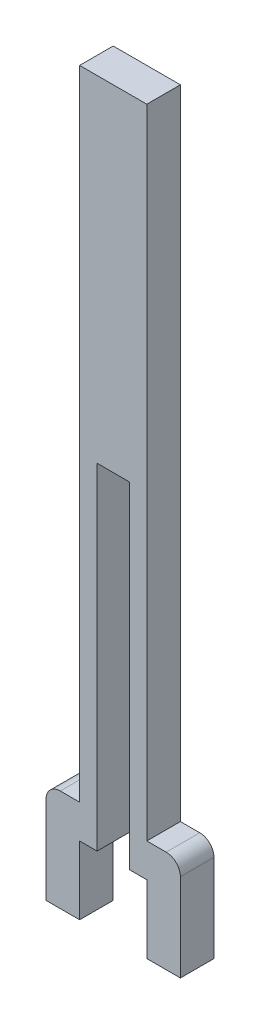
ISO-10303-21;
HEADER;
FILE_DESCRIPTION(('STEP AP214'),'2;1');
FILE_NAME('part.step','',(''),(''),'','','');
FILE_SCHEMA(('AUTOMOTIVE_DESIGN { 1 0 10303 214 1 1 1 1 }'));
ENDSEC;
DATA;
#1=APPLICATION_CONTEXT('core data for automotive mechanical design processes');
#2=APPLICATION_PROTOCOL_DEFINITION('international standard','automotive_design',2000,#1);
#3=PRODUCT_CONTEXT('',#1,'mechanical');
#4=PRODUCT('Part','Part','',(#3));
#5=PRODUCT_RELATED_PRODUCT_CATEGORY('part','',(#4));
#6=PRODUCT_DEFINITION_FORMATION('','',#4);
#7=PRODUCT_DEFINITION_CONTEXT('part definition',#1,'design');
#8=PRODUCT_DEFINITION('design','',#6,#7);
#9=PRODUCT_DEFINITION_SHAPE('','',#8);
#10=(LENGTH_UNIT() NAMED_UNIT(*) SI_UNIT(.MILLI.,.METRE.));
#11=(NAMED_UNIT(*) PLANE_ANGLE_UNIT() SI_UNIT($,.RADIAN.));
#12=(NAMED_UNIT(*) SI_UNIT($,.STERADIAN.) SOLID_ANGLE_UNIT());
#13=UNCERTAINTY_MEASURE_WITH_UNIT(LENGTH_MEASURE(1.E-05),#10,'distance_accuracy_value','');
#14=(GEOMETRIC_REPRESENTATION_CONTEXT(3) GLOBAL_UNCERTAINTY_ASSIGNED_CONTEXT((#13)) GLOBAL_UNIT_ASSIGNED_CONTEXT((#10,
#11,#12)) REPRESENTATION_CONTEXT('',''));
#15=CARTESIAN_POINT('',(0.,0.,0.));
#16=DIRECTION('',(0.,0.,1.));
#17=DIRECTION('',(1.,0.,0.));
#18=AXIS2_PLACEMENT_3D('',#15,#16,#17);
#19=CARTESIAN_POINT('',(0.,-26.944,3.));
#20=DIRECTION('',(0.,1.,0.));
#21=DIRECTION('',(0.,0.,1.));
#22=AXIS2_PLACEMENT_3D('',#19,#20,#21);
#23=PLANE('',#22);
#24=DIRECTION('',(1.,0.,0.));
#25=VECTOR('',#24,1.);
#26=CARTESIAN_POINT('',(0.,-26.944,3.));
#27=LINE('',#26,#25);
#28=CARTESIAN_POINT('',(1.43999999999999,-26.944,3.));
#29=VERTEX_POINT('',#28);
#30=CARTESIAN_POINT('',(3.,-26.944,3.));
#31=VERTEX_POINT('',#30);
#32=EDGE_CURVE('E220',#29,#31,#27,.T.);
#33=ORIENTED_EDGE('',*,*,#32,.F.);
#34=DIRECTION('',(0.,0.,-1.));
#35=VECTOR('',#34,1.);
#36=CARTESIAN_POINT('',(1.43999999999999,-26.944,33.1319504181193));
#37=LINE('',#36,#35);
#38=CARTESIAN_POINT('',(1.43999999999999,-26.944,0.));
#39=VERTEX_POINT('',#38);
#40=EDGE_CURVE('E176',#29,#39,#37,.T.);
#41=ORIENTED_EDGE('',*,*,#40,.T.);
#42=DIRECTION('',(1.,0.,0.));
#43=VECTOR('',#42,1.);
#44=CARTESIAN_POINT('',(0.,-26.944,0.));
#45=LINE('',#44,#43);
#46=CARTESIAN_POINT('',(3.,-26.944,0.));
#47=VERTEX_POINT('',#46);
#48=EDGE_CURVE('E251',#39,#47,#45,.T.);
#49=ORIENTED_EDGE('',*,*,#48,.T.);
#50=DIRECTION('',(0.,0.,-1.));
#51=VECTOR('',#50,1.);
#52=CARTESIAN_POINT('',(3.,-26.944,3.));
#53=LINE('',#52,#51);
#54=EDGE_CURVE('E276',#31,#47,#53,.T.);
#55=ORIENTED_EDGE('',*,*,#54,.F.);
#56=EDGE_LOOP('',(#33,#41,#49,#55));
#57=FACE_BOUND('',#56,.T.);
#58=ADVANCED_FACE('F45',(#57),#23,.F.);
#59=CARTESIAN_POINT('',(0.,33.044,3.));
#60=DIRECTION('',(0.,1.,0.));
#61=DIRECTION('',(0.,0.,1.));
#62=AXIS2_PLACEMENT_3D('',#59,#60,#61);
#63=PLANE('',#62);
#64=DIRECTION('',(1.,0.,0.));
#65=VECTOR('',#64,1.);
#66=CARTESIAN_POINT('',(0.,33.044,0.));
#67=LINE('',#66,#65);
#68=CARTESIAN_POINT('',(-3.,33.044,0.));
#69=VERTEX_POINT('',#68);
#70=CARTESIAN_POINT('',(3.,33.044,0.));
#71=VERTEX_POINT('',#70);
#72=EDGE_CURVE('E204',#69,#71,#67,.T.);
#73=ORIENTED_EDGE('',*,*,#72,.F.);
#74=DIRECTION('',(0.,0.,-1.));
#75=VECTOR('',#74,1.);
#76=CARTESIAN_POINT('',(-3.,33.044,3.));
#77=LINE('',#76,#75);
#78=CARTESIAN_POINT('',(-3.,33.044,3.));
#79=VERTEX_POINT('',#78);
#80=EDGE_CURVE('E290',#79,#69,#77,.T.);
#81=ORIENTED_EDGE('',*,*,#80,.F.);
#82=DIRECTION('',(1.,0.,0.));
#83=VECTOR('',#82,1.);
#84=CARTESIAN_POINT('',(0.,33.044,3.));
#85=LINE('',#84,#83);
#86=CARTESIAN_POINT('',(3.,33.044,3.));
#87=VERTEX_POINT('',#86);
#88=EDGE_CURVE('E205',#79,#87,#85,.T.);
#89=ORIENTED_EDGE('',*,*,#88,.T.);
#90=DIRECTION('',(0.,0.,-1.));
#91=VECTOR('',#90,1.);
#92=CARTESIAN_POINT('',(3.,33.044,3.));
#93=LINE('',#92,#91);
#94=EDGE_CURVE('E236',#87,#71,#93,.T.);
#95=ORIENTED_EDGE('',*,*,#94,.T.);
#96=EDGE_LOOP('',(#73,#81,#89,#95));
#97=FACE_BOUND('',#96,.T.);
#98=ADVANCED_FACE('F336',(#97),#63,.T.);
#99=CARTESIAN_POINT('',(-3.,0.,3.));
#100=DIRECTION('',(-1.,0.,0.));
#101=DIRECTION('',(0.,0.,1.));
#102=AXIS2_PLACEMENT_3D('',#99,#100,#101);
#103=PLANE('',#102);
#104=DIRECTION('',(0.,1.,0.));
#105=VECTOR('',#104,1.);
#106=CARTESIAN_POINT('',(-3.,0.,0.));
#107=LINE('',#106,#105);
#108=CARTESIAN_POINT('',(-3.,-23.944,0.));
#109=VERTEX_POINT('',#108);
#110=EDGE_CURVE('E239',#109,#69,#107,.T.);
#111=ORIENTED_EDGE('',*,*,#110,.F.);
#112=DIRECTION('',(0.,0.,-1.));
#113=VECTOR('',#112,1.);
#114=CARTESIAN_POINT('',(-3.,-23.944,3.));
#115=LINE('',#114,#113);
#116=CARTESIAN_POINT('',(-3.,-23.944,3.));
#117=VERTEX_POINT('',#116);
#118=EDGE_CURVE('E288',#117,#109,#115,.T.);
#119=ORIENTED_EDGE('',*,*,#118,.F.);
#120=DIRECTION('',(0.,1.,0.));
#121=VECTOR('',#120,1.);
#122=CARTESIAN_POINT('',(-3.,0.,3.));
#123=LINE('',#122,#121);
#124=EDGE_CURVE('E208',#117,#79,#123,.T.);
#125=ORIENTED_EDGE('',*,*,#124,.T.);
#126=ORIENTED_EDGE('',*,*,#80,.T.);
#127=EDGE_LOOP('',(#111,#119,#125,#126));
#128=FACE_BOUND('',#127,.T.);
#129=ADVANCED_FACE('F342',(#128),#103,.T.);
#130=CARTESIAN_POINT('',(0.,-23.944,3.));
#131=DIRECTION('',(0.,-1.,0.));
#132=DIRECTION('',(0.,0.,-1.));
#133=AXIS2_PLACEMENT_3D('',#130,#131,#132);
#134=PLANE('',#133);
#135=DIRECTION('',(-1.,0.,0.));
#136=VECTOR('',#135,1.);
#137=CARTESIAN_POINT('',(0.,-23.944,0.));
#138=LINE('',#137,#136);
#139=CARTESIAN_POINT('',(-4.73,-23.944,0.));
#140=VERTEX_POINT('',#139);
#141=EDGE_CURVE('E242',#109,#140,#138,.T.);
#142=ORIENTED_EDGE('',*,*,#141,.T.);
#143=DIRECTION('',(0.,0.,-1.));
#144=VECTOR('',#143,1.);
#145=CARTESIAN_POINT('',(-4.73,-23.944,3.));
#146=LINE('',#145,#144);
#147=CARTESIAN_POINT('',(-4.73,-23.944,3.));
#148=VERTEX_POINT('',#147);
#149=EDGE_CURVE('E11',#140,#148,#146,.F.);
#150=ORIENTED_EDGE('',*,*,#149,.T.);
#151=DIRECTION('',(-1.,0.,0.));
#152=VECTOR('',#151,1.);
#153=CARTESIAN_POINT('',(0.,-23.944,3.));
#154=LINE('',#153,#152);
#155=EDGE_CURVE('E212',#117,#148,#154,.T.);
#156=ORIENTED_EDGE('',*,*,#155,.F.);
#157=ORIENTED_EDGE('',*,*,#118,.T.);
#158=EDGE_LOOP('',(#142,#150,#156,#157));
#159=FACE_BOUND('',#158,.T.);
#160=ADVANCED_FACE('F362',(#159),#134,.F.);
#161=CARTESIAN_POINT('',(-6.,0.,3.));
#162=DIRECTION('',(1.,0.,0.));
#163=DIRECTION('',(0.,0.,-1.));
#164=AXIS2_PLACEMENT_3D('',#161,#162,#163);
#165=PLANE('',#164);
#166=DIRECTION('',(0.,-1.,0.));
#167=VECTOR('',#166,1.);
#168=CARTESIAN_POINT('',(-6.,0.,3.));
#169=LINE('',#168,#167);
#170=CARTESIAN_POINT('',(-6.,-25.214,3.));
#171=VERTEX_POINT('',#170);
#172=CARTESIAN_POINT('',(-6.,-33.044,3.));
#173=VERTEX_POINT('',#172);
#174=EDGE_CURVE('E214',#171,#173,#169,.T.);
#175=ORIENTED_EDGE('',*,*,#174,.F.);
#176=DIRECTION('',(0.,0.,-1.));
#177=VECTOR('',#176,1.);
#178=CARTESIAN_POINT('',(-6.,-25.214,3.));
#179=LINE('',#178,#177);
#180=CARTESIAN_POINT('',(-6.,-25.214,0.));
#181=VERTEX_POINT('',#180);
#182=EDGE_CURVE('E53',#171,#181,#179,.T.);
#183=ORIENTED_EDGE('',*,*,#182,.T.);
#184=DIRECTION('',(0.,-1.,0.));
#185=VECTOR('',#184,1.);
#186=CARTESIAN_POINT('',(-6.,0.,0.));
#187=LINE('',#186,#185);
#188=CARTESIAN_POINT('',(-6.,-33.044,0.));
#189=VERTEX_POINT('',#188);
#190=EDGE_CURVE('E245',#181,#189,#187,.T.);
#191=ORIENTED_EDGE('',*,*,#190,.T.);
#192=DIRECTION('',(0.,0.,-1.));
#193=VECTOR('',#192,1.);
#194=CARTESIAN_POINT('',(-6.,-33.044,3.));
#195=LINE('',#194,#193);
#196=EDGE_CURVE('E285',#173,#189,#195,.T.);
#197=ORIENTED_EDGE('',*,*,#196,.F.);
#198=EDGE_LOOP('',(#175,#183,#191,#197));
#199=FACE_BOUND('',#198,.T.);
#200=ADVANCED_FACE('F307',(#199),#165,.F.);
#201=CARTESIAN_POINT('',(0.,-33.044,3.));
#202=DIRECTION('',(0.,1.,0.));
#203=DIRECTION('',(-1.,0.,0.));
#204=AXIS2_PLACEMENT_3D('',#201,#202,#203);
#205=PLANE('',#204);
#206=DIRECTION('',(1.,0.,0.));
#207=VECTOR('',#206,1.);
#208=CARTESIAN_POINT('',(0.,-33.044,0.));
#209=LINE('',#208,#207);
#210=CARTESIAN_POINT('',(-3.,-33.044,0.));
#211=VERTEX_POINT('',#210);
#212=EDGE_CURVE('E247',#189,#211,#209,.T.);
#213=ORIENTED_EDGE('',*,*,#212,.T.);
#214=DIRECTION('',(0.,0.,-1.));
#215=VECTOR('',#214,1.);
#216=CARTESIAN_POINT('',(-3.,-33.044,3.));
#217=LINE('',#216,#215);
#218=CARTESIAN_POINT('',(-3.,-33.044,3.));
#219=VERTEX_POINT('',#218);
#220=EDGE_CURVE('E282',#219,#211,#217,.T.);
#221=ORIENTED_EDGE('',*,*,#220,.F.);
#222=DIRECTION('',(1.,0.,0.));
#223=VECTOR('',#222,1.);
#224=CARTESIAN_POINT('',(0.,-33.044,3.));
#225=LINE('',#224,#223);
#226=EDGE_CURVE('E216',#173,#219,#225,.T.);
#227=ORIENTED_EDGE('',*,*,#226,.F.);
#228=ORIENTED_EDGE('',*,*,#196,.T.);
#229=EDGE_LOOP('',(#213,#221,#227,#228));
#230=FACE_BOUND('',#229,.T.);
#231=ADVANCED_FACE('F319',(#230),#205,.F.);
#232=CARTESIAN_POINT('',(-3.,0.,3.));
#233=DIRECTION('',(-1.,0.,0.));
#234=DIRECTION('',(0.,0.,1.));
#235=AXIS2_PLACEMENT_3D('',#232,#233,#234);
#236=PLANE('',#235);
#237=DIRECTION('',(0.,1.,0.));
#238=VECTOR('',#237,1.);
#239=CARTESIAN_POINT('',(-3.,0.,0.));
#240=LINE('',#239,#238);
#241=CARTESIAN_POINT('',(-3.,-26.944,0.));
#242=VERTEX_POINT('',#241);
#243=EDGE_CURVE('E249',#211,#242,#240,.T.);
#244=ORIENTED_EDGE('',*,*,#243,.T.);
#245=DIRECTION('',(0.,0.,-1.));
#246=VECTOR('',#245,1.);
#247=CARTESIAN_POINT('',(-3.,-26.944,3.));
#248=LINE('',#247,#246);
#249=CARTESIAN_POINT('',(-3.,-26.944,3.));
#250=VERTEX_POINT('',#249);
#251=EDGE_CURVE('E279',#250,#242,#248,.T.);
#252=ORIENTED_EDGE('',*,*,#251,.F.);
#253=DIRECTION('',(0.,1.,0.));
#254=VECTOR('',#253,1.);
#255=CARTESIAN_POINT('',(-3.,0.,3.));
#256=LINE('',#255,#254);
#257=EDGE_CURVE('E218',#219,#250,#256,.T.);
#258=ORIENTED_EDGE('',*,*,#257,.F.);
#259=ORIENTED_EDGE('',*,*,#220,.T.);
#260=EDGE_LOOP('',(#244,#252,#258,#259));
#261=FACE_BOUND('',#260,.T.);
#262=ADVANCED_FACE('F323',(#261),#236,.F.);
#263=CARTESIAN_POINT('',(-1.44000000000001,-26.944,0.));
#264=VERTEX_POINT('',#263);
#265=EDGE_CURVE('E252',#242,#264,#45,.T.);
#266=ORIENTED_EDGE('',*,*,#265,.T.);
#267=DIRECTION('',(0.,0.,-1.));
#268=VECTOR('',#267,1.);
#269=CARTESIAN_POINT('',(-1.44000000000001,-26.944,33.1319504181193));
#270=LINE('',#269,#268);
#271=CARTESIAN_POINT('',(-1.44000000000001,-26.944,3.));
#272=VERTEX_POINT('',#271);
#273=EDGE_CURVE('E60',#272,#264,#270,.T.);
#274=ORIENTED_EDGE('',*,*,#273,.F.);
#275=EDGE_CURVE('E221',#250,#272,#27,.T.);
#276=ORIENTED_EDGE('',*,*,#275,.F.);
#277=ORIENTED_EDGE('',*,*,#251,.T.);
#278=EDGE_LOOP('',(#266,#274,#276,#277));
#279=FACE_BOUND('',#278,.T.);
#280=ADVANCED_FACE('F327',(#279),#23,.F.);
#281=CARTESIAN_POINT('',(3.,0.,3.));
#282=DIRECTION('',(-1.,0.,0.));
#283=DIRECTION('',(0.,0.,1.));
#284=AXIS2_PLACEMENT_3D('',#281,#282,#283);
#285=PLANE('',#284);
#286=DIRECTION('',(0.,1.,0.));
#287=VECTOR('',#286,1.);
#288=CARTESIAN_POINT('',(3.,0.,0.));
#289=LINE('',#288,#287);
#290=CARTESIAN_POINT('',(3.,-33.044,0.));
#291=VERTEX_POINT('',#290);
#292=EDGE_CURVE('E255',#291,#47,#289,.T.);
#293=ORIENTED_EDGE('',*,*,#292,.F.);
#294=DIRECTION('',(0.,0.,-1.));
#295=VECTOR('',#294,1.);
#296=CARTESIAN_POINT('',(3.,-33.044,3.));
#297=LINE('',#296,#295);
#298=CARTESIAN_POINT('',(3.,-33.044,3.));
#299=VERTEX_POINT('',#298);
#300=EDGE_CURVE('E274',#299,#291,#297,.T.);
#301=ORIENTED_EDGE('',*,*,#300,.F.);
#302=DIRECTION('',(0.,1.,0.));
#303=VECTOR('',#302,1.);
#304=CARTESIAN_POINT('',(3.,0.,3.));
#305=LINE('',#304,#303);
#306=EDGE_CURVE('E223',#299,#31,#305,.T.);
#307=ORIENTED_EDGE('',*,*,#306,.T.);
#308=ORIENTED_EDGE('',*,*,#54,.T.);
#309=EDGE_LOOP('',(#293,#301,#307,#308));
#310=FACE_BOUND('',#309,.T.);
#311=ADVANCED_FACE('F348',(#310),#285,.T.);
#312=CARTESIAN_POINT('',(0.,-33.044,3.));
#313=DIRECTION('',(0.,1.,0.));
#314=DIRECTION('',(0.,0.,1.));
#315=AXIS2_PLACEMENT_3D('',#312,#313,#314);
#316=PLANE('',#315);
#317=DIRECTION('',(1.,0.,0.));
#318=VECTOR('',#317,1.);
#319=CARTESIAN_POINT('',(0.,-33.044,0.));
#320=LINE('',#319,#318);
#321=CARTESIAN_POINT('',(6.,-33.044,0.));
#322=VERTEX_POINT('',#321);
#323=EDGE_CURVE('E258',#291,#322,#320,.T.);
#324=ORIENTED_EDGE('',*,*,#323,.T.);
#325=DIRECTION('',(0.,0.,-1.));
#326=VECTOR('',#325,1.);
#327=CARTESIAN_POINT('',(6.,-33.044,3.));
#328=LINE('',#327,#326);
#329=CARTESIAN_POINT('',(6.,-33.044,3.));
#330=VERTEX_POINT('',#329);
#331=EDGE_CURVE('E271',#330,#322,#328,.T.);
#332=ORIENTED_EDGE('',*,*,#331,.F.);
#333=DIRECTION('',(1.,0.,0.));
#334=VECTOR('',#333,1.);
#335=CARTESIAN_POINT('',(0.,-33.044,3.));
#336=LINE('',#335,#334);
#337=EDGE_CURVE('E226',#299,#330,#336,.T.);
#338=ORIENTED_EDGE('',*,*,#337,.F.);
#339=ORIENTED_EDGE('',*,*,#300,.T.);
#340=EDGE_LOOP('',(#324,#332,#338,#339));
#341=FACE_BOUND('',#340,.T.);
#342=ADVANCED_FACE('F353',(#341),#316,.F.);
#343=CARTESIAN_POINT('',(6.,0.,3.));
#344=DIRECTION('',(-1.,0.,0.));
#345=DIRECTION('',(0.,0.,1.));
#346=AXIS2_PLACEMENT_3D('',#343,#344,#345);
#347=PLANE('',#346);
#348=DIRECTION('',(0.,1.,0.));
#349=VECTOR('',#348,1.);
#350=CARTESIAN_POINT('',(6.,0.,0.));
#351=LINE('',#350,#349);
#352=CARTESIAN_POINT('',(6.,-25.214,0.));
#353=VERTEX_POINT('',#352);
#354=EDGE_CURVE('E260',#322,#353,#351,.T.);
#355=ORIENTED_EDGE('',*,*,#354,.T.);
#356=DIRECTION('',(0.,0.,-1.));
#357=VECTOR('',#356,1.);
#358=CARTESIAN_POINT('',(6.,-25.214,3.));
#359=LINE('',#358,#357);
#360=CARTESIAN_POINT('',(6.,-25.214,3.));
#361=VERTEX_POINT('',#360);
#362=EDGE_CURVE('E299',#353,#361,#359,.F.);
#363=ORIENTED_EDGE('',*,*,#362,.T.);
#364=DIRECTION('',(0.,1.,0.));
#365=VECTOR('',#364,1.);
#366=CARTESIAN_POINT('',(6.,0.,3.));
#367=LINE('',#366,#365);
#368=EDGE_CURVE('E228',#330,#361,#367,.T.);
#369=ORIENTED_EDGE('',*,*,#368,.F.);
#370=ORIENTED_EDGE('',*,*,#331,.T.);
#371=EDGE_LOOP('',(#355,#363,#369,#370));
#372=FACE_BOUND('',#371,.T.);
#373=ADVANCED_FACE('F398',(#372),#347,.F.);
#374=CARTESIAN_POINT('',(0.,-23.944,3.));
#375=DIRECTION('',(0.,-1.,0.));
#376=DIRECTION('',(0.,0.,-1.));
#377=AXIS2_PLACEMENT_3D('',#374,#375,#376);
#378=PLANE('',#377);
#379=DIRECTION('',(-1.,0.,0.));
#380=VECTOR('',#379,1.);
#381=CARTESIAN_POINT('',(0.,-23.944,3.));
#382=LINE('',#381,#380);
#383=CARTESIAN_POINT('',(4.73,-23.944,3.));
#384=VERTEX_POINT('',#383);
#385=CARTESIAN_POINT('',(3.,-23.944,3.));
#386=VERTEX_POINT('',#385);
#387=EDGE_CURVE('E231',#384,#386,#382,.T.);
#388=ORIENTED_EDGE('',*,*,#387,.F.);
#389=DIRECTION('',(0.,0.,-1.));
#390=VECTOR('',#389,1.);
#391=CARTESIAN_POINT('',(4.73,-23.944,3.));
#392=LINE('',#391,#390);
#393=CARTESIAN_POINT('',(4.73,-23.944,0.));
#394=VERTEX_POINT('',#393);
#395=EDGE_CURVE('E292',#384,#394,#392,.T.);
#396=ORIENTED_EDGE('',*,*,#395,.T.);
#397=DIRECTION('',(-1.,0.,0.));
#398=VECTOR('',#397,1.);
#399=CARTESIAN_POINT('',(0.,-23.944,0.));
#400=LINE('',#399,#398);
#401=CARTESIAN_POINT('',(3.,-23.944,0.));
#402=VERTEX_POINT('',#401);
#403=EDGE_CURVE('E263',#394,#402,#400,.T.);
#404=ORIENTED_EDGE('',*,*,#403,.T.);
#405=DIRECTION('',(0.,0.,-1.));
#406=VECTOR('',#405,1.);
#407=CARTESIAN_POINT('',(3.,-23.944,3.));
#408=LINE('',#407,#406);
#409=EDGE_CURVE('E268',#386,#402,#408,.T.);
#410=ORIENTED_EDGE('',*,*,#409,.F.);
#411=EDGE_LOOP('',(#388,#396,#404,#410));
#412=FACE_BOUND('',#411,.T.);
#413=ADVANCED_FACE('F384',(#412),#378,.F.);
#414=CARTESIAN_POINT('',(3.,0.,3.));
#415=DIRECTION('',(1.,0.,0.));
#416=DIRECTION('',(0.,1.,0.));
#417=AXIS2_PLACEMENT_3D('',#414,#415,#416);
#418=PLANE('',#417);
#419=DIRECTION('',(0.,-1.,0.));
#420=VECTOR('',#419,1.);
#421=CARTESIAN_POINT('',(3.,0.,0.));
#422=LINE('',#421,#420);
#423=EDGE_CURVE('E209',#71,#402,#422,.T.);
#424=ORIENTED_EDGE('',*,*,#423,.F.);
#425=ORIENTED_EDGE('',*,*,#94,.F.);
#426=DIRECTION('',(0.,-1.,0.));
#427=VECTOR('',#426,1.);
#428=CARTESIAN_POINT('',(3.,0.,3.));
#429=LINE('',#428,#427);
#430=EDGE_CURVE('E233',#87,#386,#429,.T.);
#431=ORIENTED_EDGE('',*,*,#430,.T.);
#432=ORIENTED_EDGE('',*,*,#409,.T.);
#433=EDGE_LOOP('',(#424,#425,#431,#432));
#434=FACE_BOUND('',#433,.T.);
#435=ADVANCED_FACE('F388',(#434),#418,.T.);
#436=CARTESIAN_POINT('',(0.,0.,3.));
#437=DIRECTION('',(0.,0.,1.));
#438=DIRECTION('',(1.,0.,0.));
#439=AXIS2_PLACEMENT_3D('',#436,#437,#438);
#440=PLANE('',#439);
#441=DIRECTION('',(0.,-1.,0.));
#442=VECTOR('',#441,1.);
#443=CARTESIAN_POINT('',(1.43999999999999,-26.944,3.));
#444=LINE('',#443,#442);
#445=CARTESIAN_POINT('',(1.43999999999999,3.04999999999999,3.));
#446=VERTEX_POINT('',#445);
#447=EDGE_CURVE('E170',#446,#29,#444,.T.);
#448=ORIENTED_EDGE('',*,*,#447,.T.);
#449=ORIENTED_EDGE('',*,*,#32,.T.);
#450=ORIENTED_EDGE('',*,*,#306,.F.);
#451=ORIENTED_EDGE('',*,*,#337,.T.);
#452=ORIENTED_EDGE('',*,*,#368,.T.);
#453=CARTESIAN_POINT('',(4.73,-25.214,3.));
#454=DIRECTION('',(0.,0.,1.));
#455=DIRECTION('',(1.,0.,0.));
#456=AXIS2_PLACEMENT_3D('',#453,#454,#455);
#457=CIRCLE('',#456,1.27);
#458=EDGE_CURVE('E302',#361,#384,#457,.T.);
#459=ORIENTED_EDGE('',*,*,#458,.T.);
#460=ORIENTED_EDGE('',*,*,#387,.T.);
#461=ORIENTED_EDGE('',*,*,#430,.F.);
#462=ORIENTED_EDGE('',*,*,#88,.F.);
#463=ORIENTED_EDGE('',*,*,#124,.F.);
#464=ORIENTED_EDGE('',*,*,#155,.T.);
#465=CARTESIAN_POINT('',(-4.73,-25.214,3.));
#466=DIRECTION('',(0.,0.,1.));
#467=DIRECTION('',(1.,0.,0.));
#468=AXIS2_PLACEMENT_3D('',#465,#466,#467);
#469=CIRCLE('',#468,1.27);
#470=EDGE_CURVE('E68',#148,#171,#469,.T.);
#471=ORIENTED_EDGE('',*,*,#470,.T.);
#472=ORIENTED_EDGE('',*,*,#174,.T.);
#473=ORIENTED_EDGE('',*,*,#226,.T.);
#474=ORIENTED_EDGE('',*,*,#257,.T.);
#475=ORIENTED_EDGE('',*,*,#275,.T.);
#476=DIRECTION('',(0.,1.,0.));
#477=VECTOR('',#476,1.);
#478=CARTESIAN_POINT('',(-1.44000000000001,-26.944,3.));
#479=LINE('',#478,#477);
#480=CARTESIAN_POINT('',(-1.44,3.04999999999999,3.));
#481=VERTEX_POINT('',#480);
#482=EDGE_CURVE('E191',#272,#481,#479,.T.);
#483=ORIENTED_EDGE('',*,*,#482,.T.);
#484=DIRECTION('',(1.,0.,0.));
#485=VECTOR('',#484,1.);
#486=CARTESIAN_POINT('',(1.43999999999999,3.04999999999999,3.));
#487=LINE('',#486,#485);
#488=EDGE_CURVE('E182',#481,#446,#487,.T.);
#489=ORIENTED_EDGE('',*,*,#488,.T.);
#490=EDGE_LOOP('',(#448,#449,#450,#451,#452,#459,#460,#461,#462,#463,#464,#471,#472,#473,#474,
#475,#483,#489));
#491=FACE_BOUND('',#490,.T.);
#492=ADVANCED_FACE('F189',(#491),#440,.T.);
#493=CARTESIAN_POINT('',(0.,0.,0.));
#494=DIRECTION('',(0.,0.,1.));
#495=DIRECTION('',(1.,0.,0.));
#496=AXIS2_PLACEMENT_3D('',#493,#494,#495);
#497=PLANE('',#496);
#498=ORIENTED_EDGE('',*,*,#48,.F.);
#499=DIRECTION('',(0.,-1.,0.));
#500=VECTOR('',#499,1.);
#501=CARTESIAN_POINT('',(1.43999999999999,-26.944,0.));
#502=LINE('',#501,#500);
#503=CARTESIAN_POINT('',(1.43999999999999,3.04999999999999,0.));
#504=VERTEX_POINT('',#503);
#505=EDGE_CURVE('E192',#504,#39,#502,.T.);
#506=ORIENTED_EDGE('',*,*,#505,.F.);
#507=DIRECTION('',(1.,0.,0.));
#508=VECTOR('',#507,1.);
#509=CARTESIAN_POINT('',(1.43999999999999,3.04999999999999,0.));
#510=LINE('',#509,#508);
#511=CARTESIAN_POINT('',(-1.44000000000001,3.04999999999999,0.));
#512=VERTEX_POINT('',#511);
#513=EDGE_CURVE('E185',#512,#504,#510,.T.);
#514=ORIENTED_EDGE('',*,*,#513,.F.);
#515=DIRECTION('',(0.,1.,0.));
#516=VECTOR('',#515,1.);
#517=CARTESIAN_POINT('',(-1.44000000000001,-26.944,0.));
#518=LINE('',#517,#516);
#519=EDGE_CURVE('E197',#264,#512,#518,.T.);
#520=ORIENTED_EDGE('',*,*,#519,.F.);
#521=ORIENTED_EDGE('',*,*,#265,.F.);
#522=ORIENTED_EDGE('',*,*,#243,.F.);
#523=ORIENTED_EDGE('',*,*,#212,.F.);
#524=ORIENTED_EDGE('',*,*,#190,.F.);
#525=CARTESIAN_POINT('',(-4.73,-25.214,0.));
#526=DIRECTION('',(0.,0.,1.));
#527=DIRECTION('',(1.,0.,0.));
#528=AXIS2_PLACEMENT_3D('',#525,#526,#527);
#529=CIRCLE('',#528,1.27);
#530=EDGE_CURVE('E295',#181,#140,#529,.F.);
#531=ORIENTED_EDGE('',*,*,#530,.T.);
#532=ORIENTED_EDGE('',*,*,#141,.F.);
#533=ORIENTED_EDGE('',*,*,#110,.T.);
#534=ORIENTED_EDGE('',*,*,#72,.T.);
#535=ORIENTED_EDGE('',*,*,#423,.T.);
#536=ORIENTED_EDGE('',*,*,#403,.F.);
#537=CARTESIAN_POINT('',(4.73,-25.214,0.));
#538=DIRECTION('',(0.,0.,1.));
#539=DIRECTION('',(1.,0.,0.));
#540=AXIS2_PLACEMENT_3D('',#537,#538,#539);
#541=CIRCLE('',#540,1.27);
#542=EDGE_CURVE('E297',#394,#353,#541,.F.);
#543=ORIENTED_EDGE('',*,*,#542,.T.);
#544=ORIENTED_EDGE('',*,*,#354,.F.);
#545=ORIENTED_EDGE('',*,*,#323,.F.);
#546=ORIENTED_EDGE('',*,*,#292,.T.);
#547=EDGE_LOOP('',(#498,#506,#514,#520,#521,#522,#523,#524,#531,#532,#533,#534,#535,#536,#543,
#544,#545,#546));
#548=FACE_BOUND('',#547,.T.);
#549=ADVANCED_FACE('F313',(#548),#497,.F.);
#550=CARTESIAN_POINT('',(4.73,-25.214,3.));
#551=DIRECTION('',(0.,0.,-1.));
#552=DIRECTION('',(-1.,0.,0.));
#553=AXIS2_PLACEMENT_3D('',#550,#551,#552);
#554=CYLINDRICAL_SURFACE('',#553,1.27);
#555=ORIENTED_EDGE('',*,*,#458,.F.);
#556=ORIENTED_EDGE('',*,*,#362,.F.);
#557=ORIENTED_EDGE('',*,*,#542,.F.);
#558=ORIENTED_EDGE('',*,*,#395,.F.);
#559=EDGE_LOOP('',(#555,#556,#557,#558));
#560=FACE_BOUND('',#559,.T.);
#561=ADVANCED_FACE('F368',(#560),#554,.T.);
#562=CARTESIAN_POINT('',(-4.73,-25.214,3.));
#563=DIRECTION('',(0.,0.,-1.));
#564=DIRECTION('',(-1.,0.,0.));
#565=AXIS2_PLACEMENT_3D('',#562,#563,#564);
#566=CYLINDRICAL_SURFACE('',#565,1.27);
#567=ORIENTED_EDGE('',*,*,#470,.F.);
#568=ORIENTED_EDGE('',*,*,#149,.F.);
#569=ORIENTED_EDGE('',*,*,#530,.F.);
#570=ORIENTED_EDGE('',*,*,#182,.F.);
#571=EDGE_LOOP('',(#567,#568,#569,#570));
#572=FACE_BOUND('',#571,.T.);
#573=ADVANCED_FACE('F47',(#572),#566,.T.);
#574=CARTESIAN_POINT('',(1.43999999999999,3.04999999999999,33.1319504181193));
#575=DIRECTION('',(0.,1.,0.));
#576=DIRECTION('',(0.,0.,1.));
#577=AXIS2_PLACEMENT_3D('',#574,#575,#576);
#578=PLANE('',#577);
#579=DIRECTION('',(0.,0.,-1.));
#580=VECTOR('',#579,1.);
#581=CARTESIAN_POINT('',(-1.44000000000001,3.04999999999999,33.1319504181193));
#582=LINE('',#581,#580);
#583=EDGE_CURVE('E199',#481,#512,#582,.T.);
#584=ORIENTED_EDGE('',*,*,#583,.T.);
#585=ORIENTED_EDGE('',*,*,#513,.T.);
#586=DIRECTION('',(0.,0.,-1.));
#587=VECTOR('',#586,1.);
#588=CARTESIAN_POINT('',(1.43999999999999,3.04999999999999,33.1319504181193));
#589=LINE('',#588,#587);
#590=EDGE_CURVE('E173',#446,#504,#589,.T.);
#591=ORIENTED_EDGE('',*,*,#590,.F.);
#592=ORIENTED_EDGE('',*,*,#488,.F.);
#593=EDGE_LOOP('',(#584,#585,#591,#592));
#594=FACE_BOUND('',#593,.T.);
#595=ADVANCED_FACE('F181',(#594),#578,.F.);
#596=CARTESIAN_POINT('',(1.43999999999999,-26.944,33.1319504181193));
#597=DIRECTION('',(1.,0.,0.));
#598=DIRECTION('',(0.,1.,0.));
#599=AXIS2_PLACEMENT_3D('',#596,#597,#598);
#600=PLANE('',#599);
#601=ORIENTED_EDGE('',*,*,#590,.T.);
#602=ORIENTED_EDGE('',*,*,#505,.T.);
#603=ORIENTED_EDGE('',*,*,#40,.F.);
#604=ORIENTED_EDGE('',*,*,#447,.F.);
#605=EDGE_LOOP('',(#601,#602,#603,#604));
#606=FACE_BOUND('',#605,.T.);
#607=ADVANCED_FACE('F172',(#606),#600,.F.);
#608=CARTESIAN_POINT('',(-1.44000000000001,-26.944,33.1319504181193));
#609=DIRECTION('',(-1.,0.,0.));
#610=DIRECTION('',(0.,-1.,0.));
#611=AXIS2_PLACEMENT_3D('',#608,#609,#610);
#612=PLANE('',#611);
#613=ORIENTED_EDGE('',*,*,#273,.T.);
#614=ORIENTED_EDGE('',*,*,#519,.T.);
#615=ORIENTED_EDGE('',*,*,#583,.F.);
#616=ORIENTED_EDGE('',*,*,#482,.F.);
#617=EDGE_LOOP('',(#613,#614,#615,#616));
#618=FACE_BOUND('',#617,.T.);
#619=ADVANCED_FACE('F328',(#618),#612,.F.);
#620=CLOSED_SHELL('',(#58,#98,#129,#160,#200,#231,#262,#280,#311,#342,#373,#413,#435,#492,#549,
#561,#573,#595,#607,#619));
#621=MANIFOLD_SOLID_BREP('B2',#620);
#622=ADVANCED_BREP_SHAPE_REPRESENTATION('',(#18,#621),#14);
#623=SHAPE_DEFINITION_REPRESENTATION(#9,#622);
ENDSEC;
END-ISO-10303-21;
